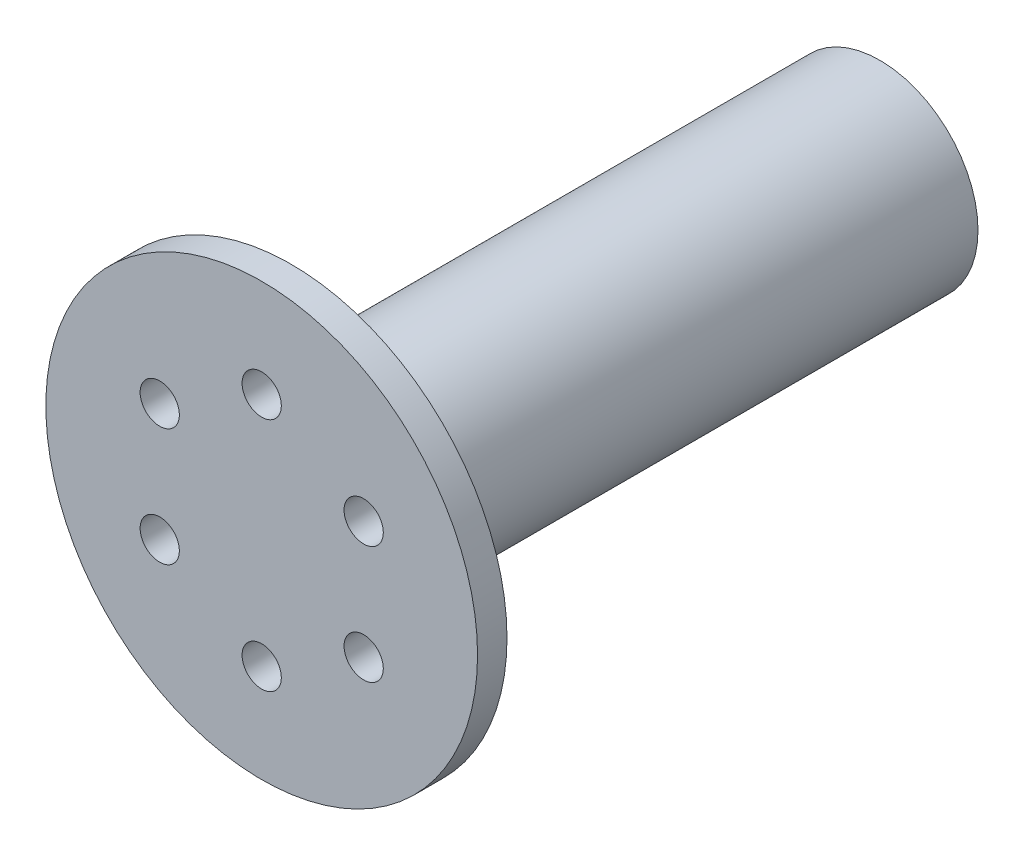
ISO-10303-21;
HEADER;
FILE_DESCRIPTION(('STEP AP214'),'2;1');
FILE_NAME('part.step','',(''),(''),'','','');
FILE_SCHEMA(('AUTOMOTIVE_DESIGN { 1 0 10303 214 1 1 1 1 }'));
ENDSEC;
DATA;
#1=APPLICATION_CONTEXT('core data for automotive mechanical design processes');
#2=APPLICATION_PROTOCOL_DEFINITION('international standard','automotive_design',2000,#1);
#3=PRODUCT_CONTEXT('',#1,'mechanical');
#4=PRODUCT('Part','Part','',(#3));
#5=PRODUCT_RELATED_PRODUCT_CATEGORY('part','',(#4));
#6=PRODUCT_DEFINITION_FORMATION('','',#4);
#7=PRODUCT_DEFINITION_CONTEXT('part definition',#1,'design');
#8=PRODUCT_DEFINITION('design','',#6,#7);
#9=PRODUCT_DEFINITION_SHAPE('','',#8);
#10=(LENGTH_UNIT() NAMED_UNIT(*) SI_UNIT(.MILLI.,.METRE.));
#11=(NAMED_UNIT(*) PLANE_ANGLE_UNIT() SI_UNIT($,.RADIAN.));
#12=(NAMED_UNIT(*) SI_UNIT($,.STERADIAN.) SOLID_ANGLE_UNIT());
#13=UNCERTAINTY_MEASURE_WITH_UNIT(LENGTH_MEASURE(1.E-05),#10,'distance_accuracy_value','');
#14=(GEOMETRIC_REPRESENTATION_CONTEXT(3) GLOBAL_UNCERTAINTY_ASSIGNED_CONTEXT((#13)) GLOBAL_UNIT_ASSIGNED_CONTEXT((#10,
#11,#12)) REPRESENTATION_CONTEXT('',''));
#15=CARTESIAN_POINT('',(0.,0.,0.));
#16=DIRECTION('',(0.,0.,1.));
#17=DIRECTION('',(1.,0.,0.));
#18=AXIS2_PLACEMENT_3D('',#15,#16,#17);
#19=CARTESIAN_POINT('',(0.,0.,30.));
#20=DIRECTION('',(0.,0.,-1.));
#21=DIRECTION('',(-1.,0.,0.));
#22=AXIS2_PLACEMENT_3D('',#19,#20,#21);
#23=CYLINDRICAL_SURFACE('',#22,5.);
#24=CARTESIAN_POINT('',(0.,0.,30.));
#25=DIRECTION('',(0.,0.,1.));
#26=DIRECTION('',(1.,0.,0.));
#27=AXIS2_PLACEMENT_3D('',#24,#25,#26);
#28=CIRCLE('',#27,5.);
#29=CARTESIAN_POINT('',(4.33012701892237,2.50000000000031,30.));
#30=VERTEX_POINT('',#29);
#31=CARTESIAN_POINT('',(0.,5.,30.));
#32=VERTEX_POINT('',#31);
#33=EDGE_CURVE('E11',#30,#32,#28,.T.);
#34=ORIENTED_EDGE('',*,*,#33,.F.);
#35=CARTESIAN_POINT('',(4.33012701892272,-2.49999999999969,30.));
#36=VERTEX_POINT('',#35);
#37=EDGE_CURVE('E52',#36,#30,#28,.T.);
#38=ORIENTED_EDGE('',*,*,#37,.F.);
#39=CARTESIAN_POINT('',(7.07072903162516E-13,-5.,30.));
#40=VERTEX_POINT('',#39);
#41=EDGE_CURVE('E190',#40,#36,#28,.T.);
#42=ORIENTED_EDGE('',*,*,#41,.F.);
#43=CARTESIAN_POINT('',(-4.33012701892166,-2.50000000000031,30.));
#44=VERTEX_POINT('',#43);
#45=EDGE_CURVE('E195',#44,#40,#28,.T.);
#46=ORIENTED_EDGE('',*,*,#45,.F.);
#47=CARTESIAN_POINT('',(-4.33012701892202,2.49999999999969,30.));
#48=VERTEX_POINT('',#47);
#49=EDGE_CURVE('E199',#48,#44,#28,.T.);
#50=ORIENTED_EDGE('',*,*,#49,.F.);
#51=EDGE_CURVE('E51',#32,#48,#28,.T.);
#52=ORIENTED_EDGE('',*,*,#51,.F.);
#53=EDGE_LOOP('',(#34,#38,#42,#46,#50,#52));
#54=FACE_BOUND('',#53,.T.);
#55=CARTESIAN_POINT('',(0.,0.,0.));
#56=DIRECTION('',(0.,0.,1.));
#57=DIRECTION('',(1.,0.,0.));
#58=AXIS2_PLACEMENT_3D('',#55,#56,#57);
#59=CIRCLE('',#58,5.);
#60=CARTESIAN_POINT('',(5.,0.,0.));
#61=VERTEX_POINT('',#60);
#62=EDGE_CURVE('E45',#61,#61,#59,.T.);
#63=ORIENTED_EDGE('',*,*,#62,.T.);
#64=EDGE_LOOP('',(#63));
#65=FACE_BOUND('',#64,.T.);
#66=ADVANCED_FACE('F42',(#54,#65),#23,.T.);
#67=CARTESIAN_POINT('',(0.,0.,0.));
#68=DIRECTION('',(0.,0.,1.));
#69=DIRECTION('',(1.,0.,0.));
#70=AXIS2_PLACEMENT_3D('',#67,#68,#69);
#71=PLANE('',#70);
#72=DIRECTION('',(0.,-1.,0.));
#73=VECTOR('',#72,1.);
#74=CARTESIAN_POINT('',(0.5,-1.4142135623731,0.));
#75=LINE('',#74,#73);
#76=CARTESIAN_POINT('',(0.5,-1.4142135623731,0.));
#77=VERTEX_POINT('',#76);
#78=CARTESIAN_POINT('',(0.5,-2.51403751433568,0.));
#79=VERTEX_POINT('',#78);
#80=EDGE_CURVE('E144',#77,#79,#75,.T.);
#81=ORIENTED_EDGE('',*,*,#80,.F.);
#82=CARTESIAN_POINT('',(0.,0.,0.));
#83=DIRECTION('',(0.,0.,-1.));
#84=DIRECTION('',(-1.,0.,0.));
#85=AXIS2_PLACEMENT_3D('',#82,#83,#84);
#86=CIRCLE('',#85,1.5);
#87=CARTESIAN_POINT('',(-0.5,-1.4142135623731,0.));
#88=VERTEX_POINT('',#87);
#89=EDGE_CURVE('E108',#88,#77,#86,.T.);
#90=ORIENTED_EDGE('',*,*,#89,.F.);
#91=DIRECTION('',(0.,1.,0.));
#92=VECTOR('',#91,1.);
#93=CARTESIAN_POINT('',(-0.5,-1.4142135623731,0.));
#94=LINE('',#93,#92);
#95=CARTESIAN_POINT('',(-0.5,-2.51403751433568,0.));
#96=VERTEX_POINT('',#95);
#97=EDGE_CURVE('E128',#96,#88,#94,.T.);
#98=ORIENTED_EDGE('',*,*,#97,.F.);
#99=DIRECTION('',(-1.,0.,0.));
#100=VECTOR('',#99,1.);
#101=CARTESIAN_POINT('',(0.5,-2.51403751433568,0.));
#102=LINE('',#101,#100);
#103=EDGE_CURVE('E132',#79,#96,#102,.T.);
#104=ORIENTED_EDGE('',*,*,#103,.F.);
#105=EDGE_LOOP('',(#81,#90,#98,#104));
#106=FACE_BOUND('',#105,.T.);
#107=ORIENTED_EDGE('',*,*,#62,.F.);
#108=EDGE_LOOP('',(#107));
#109=FACE_BOUND('',#108,.T.);
#110=ADVANCED_FACE('F163',(#106,#109),#71,.F.);
#111=CARTESIAN_POINT('',(0.,0.,20.));
#112=DIRECTION('',(0.,0.,-1.));
#113=DIRECTION('',(-1.,0.,0.));
#114=AXIS2_PLACEMENT_3D('',#111,#112,#113);
#115=CYLINDRICAL_SURFACE('',#114,1.5);
#116=ORIENTED_EDGE('',*,*,#89,.T.);
#117=DIRECTION('',(0.,0.,-1.));
#118=VECTOR('',#117,1.);
#119=CARTESIAN_POINT('',(0.5,-1.4142135623731,20.));
#120=LINE('',#119,#118);
#121=CARTESIAN_POINT('',(0.5,-1.4142135623731,20.));
#122=VERTEX_POINT('',#121);
#123=EDGE_CURVE('E101',#122,#77,#120,.T.);
#124=ORIENTED_EDGE('',*,*,#123,.F.);
#125=CARTESIAN_POINT('',(0.,0.,20.));
#126=DIRECTION('',(0.,0.,-1.));
#127=DIRECTION('',(-1.,0.,0.));
#128=AXIS2_PLACEMENT_3D('',#125,#126,#127);
#129=CIRCLE('',#128,1.5);
#130=CARTESIAN_POINT('',(-0.5,-1.4142135623731,20.));
#131=VERTEX_POINT('',#130);
#132=EDGE_CURVE('E105',#131,#122,#129,.T.);
#133=ORIENTED_EDGE('',*,*,#132,.F.);
#134=DIRECTION('',(0.,0.,-1.));
#135=VECTOR('',#134,1.);
#136=CARTESIAN_POINT('',(-0.5,-1.4142135623731,20.));
#137=LINE('',#136,#135);
#138=EDGE_CURVE('E151',#131,#88,#137,.T.);
#139=ORIENTED_EDGE('',*,*,#138,.T.);
#140=EDGE_LOOP('',(#116,#124,#133,#139));
#141=FACE_BOUND('',#140,.T.);
#142=ADVANCED_FACE('F103',(#141),#115,.F.);
#143=CARTESIAN_POINT('',(-0.5,-1.4142135623731,20.));
#144=DIRECTION('',(-1.,0.,0.));
#145=DIRECTION('',(0.,-1.,0.));
#146=AXIS2_PLACEMENT_3D('',#143,#144,#145);
#147=PLANE('',#146);
#148=ORIENTED_EDGE('',*,*,#97,.T.);
#149=ORIENTED_EDGE('',*,*,#138,.F.);
#150=DIRECTION('',(0.,1.,0.));
#151=VECTOR('',#150,1.);
#152=CARTESIAN_POINT('',(-0.5,-1.4142135623731,20.));
#153=LINE('',#152,#151);
#154=CARTESIAN_POINT('',(-0.5,-2.51403751433568,20.));
#155=VERTEX_POINT('',#154);
#156=EDGE_CURVE('E114',#155,#131,#153,.T.);
#157=ORIENTED_EDGE('',*,*,#156,.F.);
#158=DIRECTION('',(0.,0.,-1.));
#159=VECTOR('',#158,1.);
#160=CARTESIAN_POINT('',(-0.5,-2.51403751433568,20.));
#161=LINE('',#160,#159);
#162=EDGE_CURVE('E154',#155,#96,#161,.T.);
#163=ORIENTED_EDGE('',*,*,#162,.T.);
#164=EDGE_LOOP('',(#148,#149,#157,#163));
#165=FACE_BOUND('',#164,.T.);
#166=ADVANCED_FACE('F166',(#165),#147,.F.);
#167=CARTESIAN_POINT('',(0.5,-2.51403751433568,20.));
#168=DIRECTION('',(0.,-1.,0.));
#169=DIRECTION('',(0.,0.,-1.));
#170=AXIS2_PLACEMENT_3D('',#167,#168,#169);
#171=PLANE('',#170);
#172=ORIENTED_EDGE('',*,*,#103,.T.);
#173=ORIENTED_EDGE('',*,*,#162,.F.);
#174=DIRECTION('',(-1.,0.,0.));
#175=VECTOR('',#174,1.);
#176=CARTESIAN_POINT('',(0.5,-2.51403751433568,20.));
#177=LINE('',#176,#175);
#178=CARTESIAN_POINT('',(0.5,-2.51403751433568,20.));
#179=VERTEX_POINT('',#178);
#180=EDGE_CURVE('E123',#179,#155,#177,.T.);
#181=ORIENTED_EDGE('',*,*,#180,.F.);
#182=DIRECTION('',(0.,0.,-1.));
#183=VECTOR('',#182,1.);
#184=CARTESIAN_POINT('',(0.5,-2.51403751433568,20.));
#185=LINE('',#184,#183);
#186=EDGE_CURVE('E113',#179,#79,#185,.T.);
#187=ORIENTED_EDGE('',*,*,#186,.T.);
#188=EDGE_LOOP('',(#172,#173,#181,#187));
#189=FACE_BOUND('',#188,.T.);
#190=ADVANCED_FACE('F159',(#189),#171,.F.);
#191=CARTESIAN_POINT('',(0.5,-1.4142135623731,20.));
#192=DIRECTION('',(1.,0.,0.));
#193=DIRECTION('',(0.,1.,0.));
#194=AXIS2_PLACEMENT_3D('',#191,#192,#193);
#195=PLANE('',#194);
#196=ORIENTED_EDGE('',*,*,#80,.T.);
#197=ORIENTED_EDGE('',*,*,#186,.F.);
#198=DIRECTION('',(0.,-1.,0.));
#199=VECTOR('',#198,1.);
#200=CARTESIAN_POINT('',(0.5,-1.4142135623731,20.));
#201=LINE('',#200,#199);
#202=EDGE_CURVE('E117',#122,#179,#201,.T.);
#203=ORIENTED_EDGE('',*,*,#202,.F.);
#204=ORIENTED_EDGE('',*,*,#123,.T.);
#205=EDGE_LOOP('',(#196,#197,#203,#204));
#206=FACE_BOUND('',#205,.T.);
#207=ADVANCED_FACE('F118',(#206),#195,.F.);
#208=CARTESIAN_POINT('',(0.,0.,20.));
#209=DIRECTION('',(0.,0.,-1.));
#210=DIRECTION('',(-1.,0.,0.));
#211=AXIS2_PLACEMENT_3D('',#208,#209,#210);
#212=PLANE('',#211);
#213=ORIENTED_EDGE('',*,*,#132,.T.);
#214=ORIENTED_EDGE('',*,*,#202,.T.);
#215=ORIENTED_EDGE('',*,*,#180,.T.);
#216=ORIENTED_EDGE('',*,*,#156,.T.);
#217=EDGE_LOOP('',(#213,#214,#215,#216));
#218=FACE_BOUND('',#217,.T.);
#219=ADVANCED_FACE('F125',(#218),#212,.T.);
#220=CARTESIAN_POINT('',(0.,0.,31.5));
#221=DIRECTION('',(0.,0.,-1.));
#222=DIRECTION('',(-1.,0.,0.));
#223=AXIS2_PLACEMENT_3D('',#220,#221,#222);
#224=CYLINDRICAL_SURFACE('',#223,11.);
#225=CARTESIAN_POINT('',(0.,0.,31.5));
#226=DIRECTION('',(0.,0.,1.));
#227=DIRECTION('',(1.,0.,0.));
#228=AXIS2_PLACEMENT_3D('',#225,#226,#227);
#229=CIRCLE('',#228,11.);
#230=CARTESIAN_POINT('',(11.,0.,31.5));
#231=VERTEX_POINT('',#230);
#232=EDGE_CURVE('E145',#231,#231,#229,.T.);
#233=ORIENTED_EDGE('',*,*,#232,.F.);
#234=EDGE_LOOP('',(#233));
#235=FACE_BOUND('',#234,.T.);
#236=CARTESIAN_POINT('',(0.,0.,30.));
#237=DIRECTION('',(0.,0.,1.));
#238=DIRECTION('',(1.,0.,0.));
#239=AXIS2_PLACEMENT_3D('',#236,#237,#238);
#240=CIRCLE('',#239,11.);
#241=CARTESIAN_POINT('',(11.,0.,30.));
#242=VERTEX_POINT('',#241);
#243=EDGE_CURVE('E135',#242,#242,#240,.T.);
#244=ORIENTED_EDGE('',*,*,#243,.T.);
#245=EDGE_LOOP('',(#244));
#246=FACE_BOUND('',#245,.T.);
#247=ADVANCED_FACE('F267',(#235,#246),#224,.T.);
#248=CARTESIAN_POINT('',(0.,0.,31.5));
#249=DIRECTION('',(0.,0.,1.));
#250=DIRECTION('',(1.,0.,0.));
#251=AXIS2_PLACEMENT_3D('',#248,#249,#250);
#252=PLANE('',#251);
#253=CARTESIAN_POINT('',(0.,6.,31.5));
#254=DIRECTION('',(0.,0.,1.));
#255=DIRECTION('',(1.,0.,0.));
#256=AXIS2_PLACEMENT_3D('',#253,#254,#255);
#257=CIRCLE('',#256,1.);
#258=CARTESIAN_POINT('',(1.,6.,31.5));
#259=VERTEX_POINT('',#258);
#260=EDGE_CURVE('E222',#259,#259,#257,.T.);
#261=ORIENTED_EDGE('',*,*,#260,.F.);
#262=EDGE_LOOP('',(#261));
#263=FACE_BOUND('',#262,.T.);
#264=CARTESIAN_POINT('',(-5.19615242270642,2.99999999999963,31.5));
#265=DIRECTION('',(0.,0.,1.));
#266=DIRECTION('',(1.,0.,0.));
#267=AXIS2_PLACEMENT_3D('',#264,#265,#266);
#268=CIRCLE('',#267,1.);
#269=CARTESIAN_POINT('',(-4.19615242270642,2.99999999999963,31.5));
#270=VERTEX_POINT('',#269);
#271=EDGE_CURVE('E242',#270,#270,#268,.T.);
#272=ORIENTED_EDGE('',*,*,#271,.F.);
#273=EDGE_LOOP('',(#272));
#274=FACE_BOUND('',#273,.T.);
#275=CARTESIAN_POINT('',(-5.196152422706,-3.00000000000037,31.5));
#276=DIRECTION('',(0.,0.,1.));
#277=DIRECTION('',(1.,0.,0.));
#278=AXIS2_PLACEMENT_3D('',#275,#276,#277);
#279=CIRCLE('',#278,1.);
#280=CARTESIAN_POINT('',(-4.196152422706,-3.00000000000037,31.5));
#281=VERTEX_POINT('',#280);
#282=EDGE_CURVE('E236',#281,#281,#279,.T.);
#283=ORIENTED_EDGE('',*,*,#282,.F.);
#284=EDGE_LOOP('',(#283));
#285=FACE_BOUND('',#284,.T.);
#286=CARTESIAN_POINT('',(8.48487483795019E-13,-6.,31.5));
#287=DIRECTION('',(0.,0.,1.));
#288=DIRECTION('',(1.,0.,0.));
#289=AXIS2_PLACEMENT_3D('',#286,#287,#288);
#290=CIRCLE('',#289,1.);
#291=CARTESIAN_POINT('',(1.00000000000085,-6.,31.5));
#292=VERTEX_POINT('',#291);
#293=EDGE_CURVE('E230',#292,#292,#290,.T.);
#294=ORIENTED_EDGE('',*,*,#293,.F.);
#295=EDGE_LOOP('',(#294));
#296=FACE_BOUND('',#295,.T.);
#297=CARTESIAN_POINT('',(5.19615242270727,-2.99999999999963,31.5));
#298=DIRECTION('',(0.,0.,1.));
#299=DIRECTION('',(1.,0.,0.));
#300=AXIS2_PLACEMENT_3D('',#297,#298,#299);
#301=CIRCLE('',#300,1.);
#302=CARTESIAN_POINT('',(6.19615242270727,-2.99999999999963,31.5));
#303=VERTEX_POINT('',#302);
#304=EDGE_CURVE('E217',#303,#303,#301,.T.);
#305=ORIENTED_EDGE('',*,*,#304,.F.);
#306=EDGE_LOOP('',(#305));
#307=FACE_BOUND('',#306,.T.);
#308=CARTESIAN_POINT('',(5.19615242270684,3.00000000000037,31.5));
#309=DIRECTION('',(0.,0.,1.));
#310=DIRECTION('',(1.,0.,0.));
#311=AXIS2_PLACEMENT_3D('',#308,#309,#310);
#312=CIRCLE('',#311,1.);
#313=CARTESIAN_POINT('',(6.19615242270684,3.00000000000037,31.5));
#314=VERTEX_POINT('',#313);
#315=EDGE_CURVE('E216',#314,#314,#312,.T.);
#316=ORIENTED_EDGE('',*,*,#315,.F.);
#317=EDGE_LOOP('',(#316));
#318=FACE_BOUND('',#317,.T.);
#319=ORIENTED_EDGE('',*,*,#232,.T.);
#320=EDGE_LOOP('',(#319));
#321=FACE_BOUND('',#320,.T.);
#322=ADVANCED_FACE('F264',(#263,#274,#285,#296,#307,#318,#321),#252,.T.);
#323=CARTESIAN_POINT('',(0.,0.,30.));
#324=DIRECTION('',(0.,0.,1.));
#325=DIRECTION('',(1.,0.,0.));
#326=AXIS2_PLACEMENT_3D('',#323,#324,#325);
#327=PLANE('',#326);
#328=ORIENTED_EDGE('',*,*,#33,.T.);
#329=CARTESIAN_POINT('',(0.,6.,30.));
#330=DIRECTION('',(0.,0.,1.));
#331=DIRECTION('',(1.,0.,0.));
#332=AXIS2_PLACEMENT_3D('',#329,#330,#331);
#333=CIRCLE('',#332,1.);
#334=EDGE_CURVE('E212',#32,#32,#333,.T.);
#335=ORIENTED_EDGE('',*,*,#334,.T.);
#336=ORIENTED_EDGE('',*,*,#51,.T.);
#337=CARTESIAN_POINT('',(-5.19615242270642,2.99999999999963,30.));
#338=DIRECTION('',(0.,0.,1.));
#339=DIRECTION('',(1.,0.,0.));
#340=AXIS2_PLACEMENT_3D('',#337,#338,#339);
#341=CIRCLE('',#340,1.);
#342=EDGE_CURVE('E211',#48,#48,#341,.T.);
#343=ORIENTED_EDGE('',*,*,#342,.T.);
#344=ORIENTED_EDGE('',*,*,#49,.T.);
#345=CARTESIAN_POINT('',(-5.196152422706,-3.00000000000037,30.));
#346=DIRECTION('',(0.,0.,1.));
#347=DIRECTION('',(1.,0.,0.));
#348=AXIS2_PLACEMENT_3D('',#345,#346,#347);
#349=CIRCLE('',#348,1.);
#350=EDGE_CURVE('E240',#44,#44,#349,.T.);
#351=ORIENTED_EDGE('',*,*,#350,.T.);
#352=ORIENTED_EDGE('',*,*,#45,.T.);
#353=CARTESIAN_POINT('',(8.48487483795019E-13,-6.,30.));
#354=DIRECTION('',(0.,0.,1.));
#355=DIRECTION('',(1.,0.,0.));
#356=AXIS2_PLACEMENT_3D('',#353,#354,#355);
#357=CIRCLE('',#356,1.);
#358=EDGE_CURVE('E62',#40,#40,#357,.T.);
#359=ORIENTED_EDGE('',*,*,#358,.T.);
#360=ORIENTED_EDGE('',*,*,#41,.T.);
#361=CARTESIAN_POINT('',(5.19615242270727,-2.99999999999963,30.));
#362=DIRECTION('',(0.,0.,1.));
#363=DIRECTION('',(1.,0.,0.));
#364=AXIS2_PLACEMENT_3D('',#361,#362,#363);
#365=CIRCLE('',#364,1.);
#366=EDGE_CURVE('E57',#36,#36,#365,.T.);
#367=ORIENTED_EDGE('',*,*,#366,.T.);
#368=ORIENTED_EDGE('',*,*,#37,.T.);
#369=CARTESIAN_POINT('',(5.19615242270684,3.00000000000037,30.));
#370=DIRECTION('',(0.,0.,1.));
#371=DIRECTION('',(1.,0.,0.));
#372=AXIS2_PLACEMENT_3D('',#369,#370,#371);
#373=CIRCLE('',#372,1.);
#374=EDGE_CURVE('E213',#30,#30,#373,.T.);
#375=ORIENTED_EDGE('',*,*,#374,.T.);
#376=EDGE_LOOP('',(#328,#335,#336,#343,#344,#351,#352,#359,#360,#367,#368,#375));
#377=FACE_BOUND('',#376,.T.);
#378=ORIENTED_EDGE('',*,*,#243,.F.);
#379=EDGE_LOOP('',(#378));
#380=FACE_BOUND('',#379,.T.);
#381=ADVANCED_FACE('F209',(#377,#380),#327,.F.);
#382=CARTESIAN_POINT('',(5.19615242270684,3.00000000000037,30.));
#383=DIRECTION('',(0.,0.,1.));
#384=DIRECTION('',(1.,0.,0.));
#385=AXIS2_PLACEMENT_3D('',#382,#383,#384);
#386=CYLINDRICAL_SURFACE('',#385,1.);
#387=ORIENTED_EDGE('',*,*,#374,.F.);
#388=EDGE_LOOP('',(#387));
#389=FACE_BOUND('',#388,.T.);
#390=ORIENTED_EDGE('',*,*,#315,.T.);
#391=EDGE_LOOP('',(#390));
#392=FACE_BOUND('',#391,.T.);
#393=ADVANCED_FACE('F278',(#389,#392),#386,.F.);
#394=CARTESIAN_POINT('',(5.19615242270727,-2.99999999999963,30.));
#395=DIRECTION('',(0.,0.,1.));
#396=DIRECTION('',(1.,0.,0.));
#397=AXIS2_PLACEMENT_3D('',#394,#395,#396);
#398=CYLINDRICAL_SURFACE('',#397,1.);
#399=ORIENTED_EDGE('',*,*,#366,.F.);
#400=EDGE_LOOP('',(#399));
#401=FACE_BOUND('',#400,.T.);
#402=ORIENTED_EDGE('',*,*,#304,.T.);
#403=EDGE_LOOP('',(#402));
#404=FACE_BOUND('',#403,.T.);
#405=ADVANCED_FACE('F280',(#401,#404),#398,.F.);
#406=CARTESIAN_POINT('',(8.48487483795019E-13,-6.,30.));
#407=DIRECTION('',(0.,0.,1.));
#408=DIRECTION('',(1.,0.,0.));
#409=AXIS2_PLACEMENT_3D('',#406,#407,#408);
#410=CYLINDRICAL_SURFACE('',#409,1.);
#411=ORIENTED_EDGE('',*,*,#358,.F.);
#412=EDGE_LOOP('',(#411));
#413=FACE_BOUND('',#412,.T.);
#414=ORIENTED_EDGE('',*,*,#293,.T.);
#415=EDGE_LOOP('',(#414));
#416=FACE_BOUND('',#415,.T.);
#417=ADVANCED_FACE('F286',(#413,#416),#410,.F.);
#418=CARTESIAN_POINT('',(-5.196152422706,-3.00000000000037,30.));
#419=DIRECTION('',(0.,0.,1.));
#420=DIRECTION('',(1.,0.,0.));
#421=AXIS2_PLACEMENT_3D('',#418,#419,#420);
#422=CYLINDRICAL_SURFACE('',#421,1.);
#423=ORIENTED_EDGE('',*,*,#350,.F.);
#424=EDGE_LOOP('',(#423));
#425=FACE_BOUND('',#424,.T.);
#426=ORIENTED_EDGE('',*,*,#282,.T.);
#427=EDGE_LOOP('',(#426));
#428=FACE_BOUND('',#427,.T.);
#429=ADVANCED_FACE('F294',(#425,#428),#422,.F.);
#430=CARTESIAN_POINT('',(-5.19615242270642,2.99999999999963,30.));
#431=DIRECTION('',(0.,0.,1.));
#432=DIRECTION('',(1.,0.,0.));
#433=AXIS2_PLACEMENT_3D('',#430,#431,#432);
#434=CYLINDRICAL_SURFACE('',#433,1.);
#435=ORIENTED_EDGE('',*,*,#342,.F.);
#436=EDGE_LOOP('',(#435));
#437=FACE_BOUND('',#436,.T.);
#438=ORIENTED_EDGE('',*,*,#271,.T.);
#439=EDGE_LOOP('',(#438));
#440=FACE_BOUND('',#439,.T.);
#441=ADVANCED_FACE('F262',(#437,#440),#434,.F.);
#442=CARTESIAN_POINT('',(0.,6.,30.));
#443=DIRECTION('',(0.,0.,1.));
#444=DIRECTION('',(1.,0.,0.));
#445=AXIS2_PLACEMENT_3D('',#442,#443,#444);
#446=CYLINDRICAL_SURFACE('',#445,1.);
#447=ORIENTED_EDGE('',*,*,#334,.F.);
#448=EDGE_LOOP('',(#447));
#449=FACE_BOUND('',#448,.T.);
#450=ORIENTED_EDGE('',*,*,#260,.T.);
#451=EDGE_LOOP('',(#450));
#452=FACE_BOUND('',#451,.T.);
#453=ADVANCED_FACE('F390',(#449,#452),#446,.F.);
#454=CLOSED_SHELL('',(#66,#110,#142,#166,#190,#207,#219,#247,#322,#381,#393,#405,#417,#429,#441,#453));
#455=MANIFOLD_SOLID_BREP('B2',#454);
#456=ADVANCED_BREP_SHAPE_REPRESENTATION('',(#18,#455),#14);
#457=SHAPE_DEFINITION_REPRESENTATION(#9,#456);
ENDSEC;
END-ISO-10303-21;
